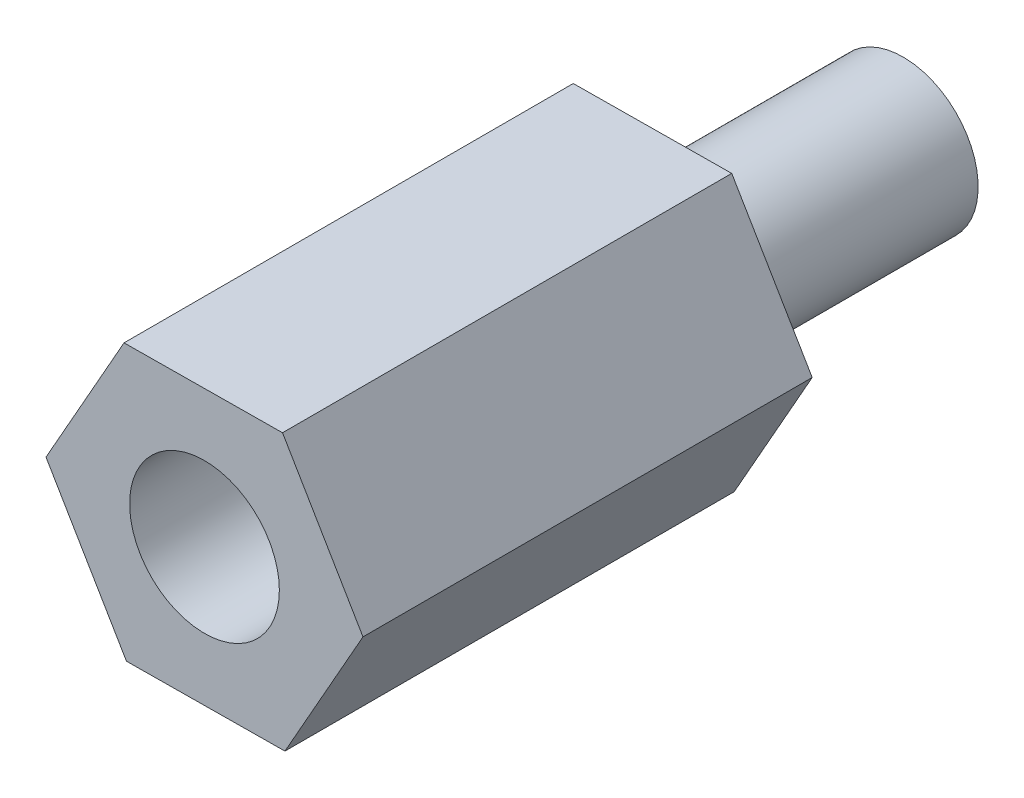
ISO-10303-21;
HEADER;
FILE_DESCRIPTION(('STEP AP214'),'2;1');
FILE_NAME('part.step','',(''),(''),'','','');
FILE_SCHEMA(('AUTOMOTIVE_DESIGN { 1 0 10303 214 1 1 1 1 }'));
ENDSEC;
DATA;
#1=APPLICATION_CONTEXT('core data for automotive mechanical design processes');
#2=APPLICATION_PROTOCOL_DEFINITION('international standard','automotive_design',2000,#1);
#3=PRODUCT_CONTEXT('',#1,'mechanical');
#4=PRODUCT('Part','Part','',(#3));
#5=PRODUCT_RELATED_PRODUCT_CATEGORY('part','',(#4));
#6=PRODUCT_DEFINITION_FORMATION('','',#4);
#7=PRODUCT_DEFINITION_CONTEXT('part definition',#1,'design');
#8=PRODUCT_DEFINITION('design','',#6,#7);
#9=PRODUCT_DEFINITION_SHAPE('','',#8);
#10=(LENGTH_UNIT() NAMED_UNIT(*) SI_UNIT(.MILLI.,.METRE.));
#11=(NAMED_UNIT(*) PLANE_ANGLE_UNIT() SI_UNIT($,.RADIAN.));
#12=(NAMED_UNIT(*) SI_UNIT($,.STERADIAN.) SOLID_ANGLE_UNIT());
#13=UNCERTAINTY_MEASURE_WITH_UNIT(LENGTH_MEASURE(1.E-05),#10,'distance_accuracy_value','');
#14=(GEOMETRIC_REPRESENTATION_CONTEXT(3) GLOBAL_UNCERTAINTY_ASSIGNED_CONTEXT((#13)) GLOBAL_UNIT_ASSIGNED_CONTEXT((#10,
#11,#12)) REPRESENTATION_CONTEXT('',''));
#15=CARTESIAN_POINT('',(0.,0.,0.));
#16=DIRECTION('',(0.,0.,1.));
#17=DIRECTION('',(1.,0.,0.));
#18=AXIS2_PLACEMENT_3D('',#15,#16,#17);
#19=CARTESIAN_POINT('',(0.,0.,-5.));
#20=DIRECTION('',(0.,0.,1.));
#21=DIRECTION('',(1.,0.,0.));
#22=AXIS2_PLACEMENT_3D('',#19,#20,#21);
#23=CYLINDRICAL_SURFACE('',#22,1.5);
#24=CARTESIAN_POINT('',(0.,0.,-5.));
#25=DIRECTION('',(0.,0.,-1.));
#26=DIRECTION('',(-1.,0.,0.));
#27=AXIS2_PLACEMENT_3D('',#24,#25,#26);
#28=CIRCLE('',#27,1.5);
#29=CARTESIAN_POINT('',(-1.5,0.,-5.));
#30=VERTEX_POINT('',#29);
#31=EDGE_CURVE('E11',#30,#30,#28,.T.);
#32=ORIENTED_EDGE('',*,*,#31,.F.);
#33=EDGE_LOOP('',(#32));
#34=FACE_BOUND('',#33,.T.);
#35=CARTESIAN_POINT('',(0.,0.,0.));
#36=DIRECTION('',(0.,0.,-1.));
#37=DIRECTION('',(-1.,0.,0.));
#38=AXIS2_PLACEMENT_3D('',#35,#36,#37);
#39=CIRCLE('',#38,1.5);
#40=CARTESIAN_POINT('',(-1.5,0.,0.));
#41=VERTEX_POINT('',#40);
#42=EDGE_CURVE('E50',#41,#41,#39,.T.);
#43=ORIENTED_EDGE('',*,*,#42,.T.);
#44=EDGE_LOOP('',(#43));
#45=FACE_BOUND('',#44,.T.);
#46=ADVANCED_FACE('F47',(#34,#45),#23,.T.);
#47=CARTESIAN_POINT('',(0.,0.,-5.));
#48=DIRECTION('',(0.,0.,-1.));
#49=DIRECTION('',(-1.,0.,0.));
#50=AXIS2_PLACEMENT_3D('',#47,#48,#49);
#51=PLANE('',#50);
#52=ORIENTED_EDGE('',*,*,#31,.T.);
#53=EDGE_LOOP('',(#52));
#54=FACE_BOUND('',#53,.T.);
#55=ADVANCED_FACE('F62',(#54),#51,.T.);
#56=CARTESIAN_POINT('',(0.,0.,0.));
#57=DIRECTION('',(0.,0.,-1.));
#58=DIRECTION('',(-1.,0.,0.));
#59=AXIS2_PLACEMENT_3D('',#56,#57,#58);
#60=PLANE('',#59);
#61=ORIENTED_EDGE('',*,*,#42,.F.);
#62=EDGE_LOOP('',(#61));
#63=FACE_BOUND('',#62,.T.);
#64=ADVANCED_FACE('F60',(#63),#60,.F.);
#65=CLOSED_SHELL('',(#46,#55,#64));
#66=MANIFOLD_SOLID_BREP('B2',#65);
#67=CARTESIAN_POINT('',(0.,0.,9.));
#68=DIRECTION('',(0.,0.,1.));
#69=DIRECTION('',(1.,0.,0.));
#70=AXIS2_PLACEMENT_3D('',#67,#68,#69);
#71=PLANE('',#70);
#72=DIRECTION('',(0.999961257640527,0.00880245522430783,0.));
#73=VECTOR('',#72,1.);
#74=CARTESIAN_POINT('',(-1.56344497664753,-2.76386923321798,9.));
#75=LINE('',#74,#73);
#76=CARTESIAN_POINT('',(-1.56344497664753,-2.76386923321798,9.));
#77=VERTEX_POINT('',#76);
#78=CARTESIAN_POINT('',(1.61185848038122,-2.73591768380492,9.));
#79=VERTEX_POINT('',#78);
#80=EDGE_CURVE('E195',#77,#79,#75,.T.);
#81=ORIENTED_EDGE('',*,*,#80,.T.);
#82=DIRECTION('',(0.492357478980338,0.870393079529086,0.));
#83=VECTOR('',#82,1.);
#84=CARTESIAN_POINT('',(1.61185848038122,-2.73591768380492,9.));
#85=LINE('',#84,#83);
#86=CARTESIAN_POINT('',(3.17530345702875,0.0279515494130611,9.));
#87=VERTEX_POINT('',#86);
#88=EDGE_CURVE('E143',#79,#87,#85,.T.);
#89=ORIENTED_EDGE('',*,*,#88,.T.);
#90=DIRECTION('',(-0.507603778660189,0.861590624304778,0.));
#91=VECTOR('',#90,1.);
#92=CARTESIAN_POINT('',(3.17530345702875,0.0279515494130611,9.));
#93=LINE('',#92,#91);
#94=CARTESIAN_POINT('',(1.56344497664753,2.76386923321798,9.));
#95=VERTEX_POINT('',#94);
#96=EDGE_CURVE('E156',#87,#95,#93,.T.);
#97=ORIENTED_EDGE('',*,*,#96,.T.);
#98=DIRECTION('',(-0.999961257640527,-0.00880245522430783,0.));
#99=VECTOR('',#98,1.);
#100=CARTESIAN_POINT('',(1.56344497664753,2.76386923321798,9.));
#101=LINE('',#100,#99);
#102=CARTESIAN_POINT('',(-1.61185848038122,2.73591768380492,9.));
#103=VERTEX_POINT('',#102);
#104=EDGE_CURVE('E150',#95,#103,#101,.T.);
#105=ORIENTED_EDGE('',*,*,#104,.T.);
#106=DIRECTION('',(-0.492357478980338,-0.870393079529086,0.));
#107=VECTOR('',#106,1.);
#108=CARTESIAN_POINT('',(-1.61185848038122,2.73591768380492,9.));
#109=LINE('',#108,#107);
#110=CARTESIAN_POINT('',(-3.17530345702875,-0.02795154941306,9.));
#111=VERTEX_POINT('',#110);
#112=EDGE_CURVE('E154',#103,#111,#109,.T.);
#113=ORIENTED_EDGE('',*,*,#112,.T.);
#114=DIRECTION('',(0.507603778660189,-0.861590624304779,0.));
#115=VECTOR('',#114,1.);
#116=CARTESIAN_POINT('',(-3.17530345702875,-0.02795154941306,9.));
#117=LINE('',#116,#115);
#118=EDGE_CURVE('E106',#111,#77,#117,.T.);
#119=ORIENTED_EDGE('',*,*,#118,.T.);
#120=EDGE_LOOP('',(#81,#89,#97,#105,#113,#119));
#121=FACE_BOUND('',#120,.T.);
#122=CARTESIAN_POINT('',(0.,0.,9.));
#123=DIRECTION('',(0.,0.,1.));
#124=DIRECTION('',(1.,0.,0.));
#125=AXIS2_PLACEMENT_3D('',#122,#123,#124);
#126=CIRCLE('',#125,1.5);
#127=CARTESIAN_POINT('',(1.5,0.,9.));
#128=VERTEX_POINT('',#127);
#129=EDGE_CURVE('E183',#128,#128,#126,.T.);
#130=ORIENTED_EDGE('',*,*,#129,.F.);
#131=EDGE_LOOP('',(#130));
#132=FACE_BOUND('',#131,.T.);
#133=ADVANCED_FACE('F88',(#121,#132),#71,.T.);
#134=CARTESIAN_POINT('',(0.,0.,0.));
#135=DIRECTION('',(0.,0.,1.));
#136=DIRECTION('',(1.,0.,0.));
#137=AXIS2_PLACEMENT_3D('',#134,#135,#136);
#138=PLANE('',#137);
#139=DIRECTION('',(0.999961257640527,0.00880245522430783,0.));
#140=VECTOR('',#139,1.);
#141=CARTESIAN_POINT('',(-1.56344497664753,-2.76386923321798,0.));
#142=LINE('',#141,#140);
#143=CARTESIAN_POINT('',(-1.56344497664753,-2.76386923321798,0.));
#144=VERTEX_POINT('',#143);
#145=CARTESIAN_POINT('',(1.61185848038122,-2.73591768380492,0.));
#146=VERTEX_POINT('',#145);
#147=EDGE_CURVE('E178',#144,#146,#142,.T.);
#148=ORIENTED_EDGE('',*,*,#147,.F.);
#149=DIRECTION('',(0.507603778660189,-0.861590624304779,0.));
#150=VECTOR('',#149,1.);
#151=CARTESIAN_POINT('',(-3.17530345702875,-0.02795154941306,0.));
#152=LINE('',#151,#150);
#153=CARTESIAN_POINT('',(-3.17530345702875,-0.02795154941306,0.));
#154=VERTEX_POINT('',#153);
#155=EDGE_CURVE('E135',#154,#144,#152,.T.);
#156=ORIENTED_EDGE('',*,*,#155,.F.);
#157=DIRECTION('',(-0.492357478980338,-0.870393079529086,0.));
#158=VECTOR('',#157,1.);
#159=CARTESIAN_POINT('',(-1.61185848038122,2.73591768380492,0.));
#160=LINE('',#159,#158);
#161=CARTESIAN_POINT('',(-1.61185848038122,2.73591768380492,0.));
#162=VERTEX_POINT('',#161);
#163=EDGE_CURVE('E129',#162,#154,#160,.T.);
#164=ORIENTED_EDGE('',*,*,#163,.F.);
#165=DIRECTION('',(-0.999961257640527,-0.00880245522430783,0.));
#166=VECTOR('',#165,1.);
#167=CARTESIAN_POINT('',(1.56344497664753,2.76386923321798,0.));
#168=LINE('',#167,#166);
#169=CARTESIAN_POINT('',(1.56344497664753,2.76386923321798,0.));
#170=VERTEX_POINT('',#169);
#171=EDGE_CURVE('E165',#170,#162,#168,.T.);
#172=ORIENTED_EDGE('',*,*,#171,.F.);
#173=DIRECTION('',(-0.507603778660189,0.861590624304778,0.));
#174=VECTOR('',#173,1.);
#175=CARTESIAN_POINT('',(3.17530345702875,0.0279515494130611,0.));
#176=LINE('',#175,#174);
#177=CARTESIAN_POINT('',(3.17530345702875,0.0279515494130611,0.));
#178=VERTEX_POINT('',#177);
#179=EDGE_CURVE('E186',#178,#170,#176,.T.);
#180=ORIENTED_EDGE('',*,*,#179,.F.);
#181=DIRECTION('',(0.492357478980338,0.870393079529086,0.));
#182=VECTOR('',#181,1.);
#183=CARTESIAN_POINT('',(1.61185848038122,-2.73591768380492,0.));
#184=LINE('',#183,#182);
#185=EDGE_CURVE('E182',#146,#178,#184,.T.);
#186=ORIENTED_EDGE('',*,*,#185,.F.);
#187=EDGE_LOOP('',(#148,#156,#164,#172,#180,#186));
#188=FACE_BOUND('',#187,.T.);
#189=CARTESIAN_POINT('',(0.,0.,0.));
#190=DIRECTION('',(0.,0.,1.));
#191=DIRECTION('',(1.,0.,0.));
#192=AXIS2_PLACEMENT_3D('',#189,#190,#191);
#193=CIRCLE('',#192,1.5);
#194=CARTESIAN_POINT('',(1.5,0.,0.));
#195=VERTEX_POINT('',#194);
#196=EDGE_CURVE('E292',#195,#195,#193,.T.);
#197=ORIENTED_EDGE('',*,*,#196,.T.);
#198=EDGE_LOOP('',(#197));
#199=FACE_BOUND('',#198,.T.);
#200=ADVANCED_FACE('F208',(#188,#199),#138,.F.);
#201=CARTESIAN_POINT('',(-1.56344497664753,-2.76386923321798,9.));
#202=DIRECTION('',(-0.00880245522430783,0.999961257640527,0.));
#203=DIRECTION('',(-0.999961257640527,-0.00880245522430783,0.));
#204=AXIS2_PLACEMENT_3D('',#201,#202,#203);
#205=PLANE('',#204);
#206=ORIENTED_EDGE('',*,*,#147,.T.);
#207=DIRECTION('',(0.,0.,-1.));
#208=VECTOR('',#207,1.);
#209=CARTESIAN_POINT('',(1.61185848038122,-2.73591768380492,9.));
#210=LINE('',#209,#208);
#211=EDGE_CURVE('E45',#79,#146,#210,.T.);
#212=ORIENTED_EDGE('',*,*,#211,.F.);
#213=ORIENTED_EDGE('',*,*,#80,.F.);
#214=DIRECTION('',(0.,0.,-1.));
#215=VECTOR('',#214,1.);
#216=CARTESIAN_POINT('',(-1.56344497664753,-2.76386923321798,9.));
#217=LINE('',#216,#215);
#218=EDGE_CURVE('E174',#77,#144,#217,.T.);
#219=ORIENTED_EDGE('',*,*,#218,.T.);
#220=EDGE_LOOP('',(#206,#212,#213,#219));
#221=FACE_BOUND('',#220,.T.);
#222=ADVANCED_FACE('F90',(#221),#205,.F.);
#223=CARTESIAN_POINT('',(1.61185848038122,-2.73591768380492,9.));
#224=DIRECTION('',(-0.870393079529086,0.492357478980338,0.));
#225=DIRECTION('',(-0.492357478980338,-0.870393079529086,0.));
#226=AXIS2_PLACEMENT_3D('',#223,#224,#225);
#227=PLANE('',#226);
#228=ORIENTED_EDGE('',*,*,#185,.T.);
#229=DIRECTION('',(0.,0.,-1.));
#230=VECTOR('',#229,1.);
#231=CARTESIAN_POINT('',(3.17530345702875,0.0279515494130611,9.));
#232=LINE('',#231,#230);
#233=EDGE_CURVE('E98',#87,#178,#232,.T.);
#234=ORIENTED_EDGE('',*,*,#233,.F.);
#235=ORIENTED_EDGE('',*,*,#88,.F.);
#236=ORIENTED_EDGE('',*,*,#211,.T.);
#237=EDGE_LOOP('',(#228,#234,#235,#236));
#238=FACE_BOUND('',#237,.T.);
#239=ADVANCED_FACE('F233',(#238),#227,.F.);
#240=CARTESIAN_POINT('',(3.17530345702875,0.0279515494130611,9.));
#241=DIRECTION('',(-0.861590624304779,-0.507603778660189,0.));
#242=DIRECTION('',(0.507603778660189,-0.861590624304779,0.));
#243=AXIS2_PLACEMENT_3D('',#240,#241,#242);
#244=PLANE('',#243);
#245=ORIENTED_EDGE('',*,*,#179,.T.);
#246=DIRECTION('',(0.,0.,-1.));
#247=VECTOR('',#246,1.);
#248=CARTESIAN_POINT('',(1.56344497664753,2.76386923321798,9.));
#249=LINE('',#248,#247);
#250=EDGE_CURVE('E167',#95,#170,#249,.T.);
#251=ORIENTED_EDGE('',*,*,#250,.F.);
#252=ORIENTED_EDGE('',*,*,#96,.F.);
#253=ORIENTED_EDGE('',*,*,#233,.T.);
#254=EDGE_LOOP('',(#245,#251,#252,#253));
#255=FACE_BOUND('',#254,.T.);
#256=ADVANCED_FACE('F205',(#255),#244,.F.);
#257=CARTESIAN_POINT('',(1.56344497664753,2.76386923321798,9.));
#258=DIRECTION('',(0.00880245522430783,-0.999961257640527,0.));
#259=DIRECTION('',(0.999961257640527,0.00880245522430783,0.));
#260=AXIS2_PLACEMENT_3D('',#257,#258,#259);
#261=PLANE('',#260);
#262=ORIENTED_EDGE('',*,*,#171,.T.);
#263=DIRECTION('',(0.,0.,-1.));
#264=VECTOR('',#263,1.);
#265=CARTESIAN_POINT('',(-1.61185848038122,2.73591768380492,9.));
#266=LINE('',#265,#264);
#267=EDGE_CURVE('E162',#103,#162,#266,.T.);
#268=ORIENTED_EDGE('',*,*,#267,.F.);
#269=ORIENTED_EDGE('',*,*,#104,.F.);
#270=ORIENTED_EDGE('',*,*,#250,.T.);
#271=EDGE_LOOP('',(#262,#268,#269,#270));
#272=FACE_BOUND('',#271,.T.);
#273=ADVANCED_FACE('F163',(#272),#261,.F.);
#274=CARTESIAN_POINT('',(-1.61185848038122,2.73591768380492,9.));
#275=DIRECTION('',(0.870393079529086,-0.492357478980338,0.));
#276=DIRECTION('',(0.492357478980338,0.870393079529086,0.));
#277=AXIS2_PLACEMENT_3D('',#274,#275,#276);
#278=PLANE('',#277);
#279=ORIENTED_EDGE('',*,*,#163,.T.);
#280=DIRECTION('',(0.,0.,-1.));
#281=VECTOR('',#280,1.);
#282=CARTESIAN_POINT('',(-3.17530345702875,-0.02795154941306,9.));
#283=LINE('',#282,#281);
#284=EDGE_CURVE('E168',#111,#154,#283,.T.);
#285=ORIENTED_EDGE('',*,*,#284,.F.);
#286=ORIENTED_EDGE('',*,*,#112,.F.);
#287=ORIENTED_EDGE('',*,*,#267,.T.);
#288=EDGE_LOOP('',(#279,#285,#286,#287));
#289=FACE_BOUND('',#288,.T.);
#290=ADVANCED_FACE('F170',(#289),#278,.F.);
#291=CARTESIAN_POINT('',(-3.17530345702875,-0.02795154941306,9.));
#292=DIRECTION('',(0.861590624304778,0.507603778660189,0.));
#293=DIRECTION('',(-0.507603778660189,0.861590624304779,0.));
#294=AXIS2_PLACEMENT_3D('',#291,#292,#293);
#295=PLANE('',#294);
#296=ORIENTED_EDGE('',*,*,#155,.T.);
#297=ORIENTED_EDGE('',*,*,#218,.F.);
#298=ORIENTED_EDGE('',*,*,#118,.F.);
#299=ORIENTED_EDGE('',*,*,#284,.T.);
#300=EDGE_LOOP('',(#296,#297,#298,#299));
#301=FACE_BOUND('',#300,.T.);
#302=ADVANCED_FACE('F213',(#301),#295,.F.);
#303=CARTESIAN_POINT('',(0.,0.,9.));
#304=DIRECTION('',(0.,0.,-1.));
#305=DIRECTION('',(-1.,0.,0.));
#306=AXIS2_PLACEMENT_3D('',#303,#304,#305);
#307=CYLINDRICAL_SURFACE('',#306,1.5);
#308=ORIENTED_EDGE('',*,*,#129,.T.);
#309=EDGE_LOOP('',(#308));
#310=FACE_BOUND('',#309,.T.);
#311=ORIENTED_EDGE('',*,*,#196,.F.);
#312=EDGE_LOOP('',(#311));
#313=FACE_BOUND('',#312,.T.);
#314=ADVANCED_FACE('F215',(#310,#313),#307,.F.);
#315=CLOSED_SHELL('',(#133,#200,#222,#239,#256,#273,#290,#302,#314));
#316=MANIFOLD_SOLID_BREP('B6',#315);
#317=ADVANCED_BREP_SHAPE_REPRESENTATION('',(#18,#66,#316),#14);
#318=SHAPE_DEFINITION_REPRESENTATION(#9,#317);
ENDSEC;
END-ISO-10303-21;
